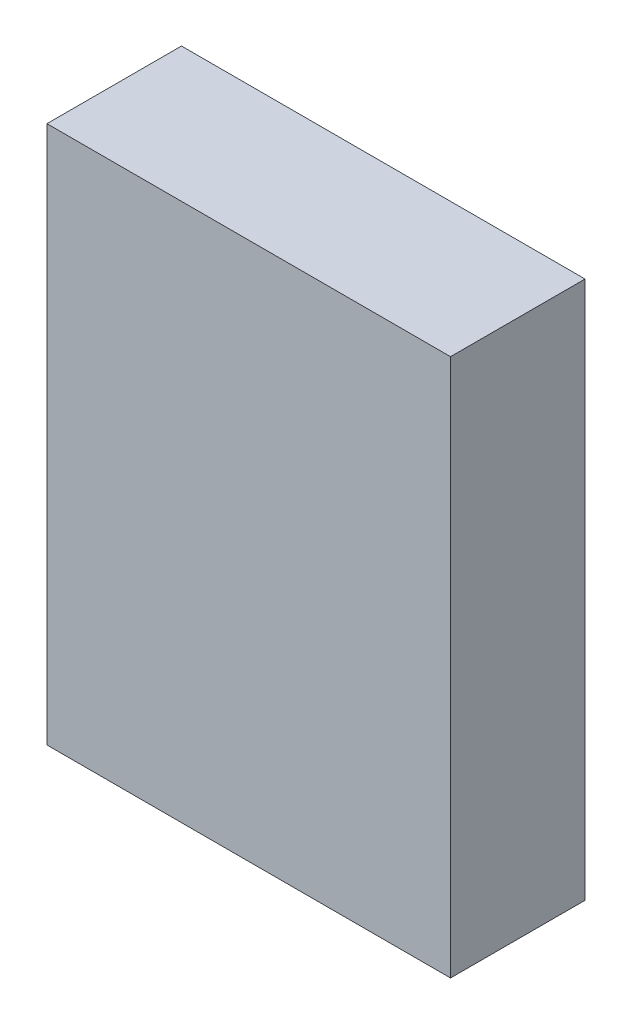
ISO-10303-21;
HEADER;
FILE_DESCRIPTION(('STEP AP214'),'2;1');
FILE_NAME('part.step','',(''),(''),'','','');
FILE_SCHEMA(('AUTOMOTIVE_DESIGN { 1 0 10303 214 1 1 1 1 }'));
ENDSEC;
DATA;
#1=APPLICATION_CONTEXT('core data for automotive mechanical design processes');
#2=APPLICATION_PROTOCOL_DEFINITION('international standard','automotive_design',2000,#1);
#3=PRODUCT_CONTEXT('',#1,'mechanical');
#4=PRODUCT('Part','Part','',(#3));
#5=PRODUCT_RELATED_PRODUCT_CATEGORY('part','',(#4));
#6=PRODUCT_DEFINITION_FORMATION('','',#4);
#7=PRODUCT_DEFINITION_CONTEXT('part definition',#1,'design');
#8=PRODUCT_DEFINITION('design','',#6,#7);
#9=PRODUCT_DEFINITION_SHAPE('','',#8);
#10=(LENGTH_UNIT() NAMED_UNIT(*) SI_UNIT(.MILLI.,.METRE.));
#11=(NAMED_UNIT(*) PLANE_ANGLE_UNIT() SI_UNIT($,.RADIAN.));
#12=(NAMED_UNIT(*) SI_UNIT($,.STERADIAN.) SOLID_ANGLE_UNIT());
#13=UNCERTAINTY_MEASURE_WITH_UNIT(LENGTH_MEASURE(1.E-05),#10,'distance_accuracy_value','');
#14=(GEOMETRIC_REPRESENTATION_CONTEXT(3) GLOBAL_UNCERTAINTY_ASSIGNED_CONTEXT((#13)) GLOBAL_UNIT_ASSIGNED_CONTEXT((#10,
#11,#12)) REPRESENTATION_CONTEXT('',''));
#15=CARTESIAN_POINT('',(0.,0.,0.));
#16=DIRECTION('',(0.,0.,1.));
#17=DIRECTION('',(1.,0.,0.));
#18=AXIS2_PLACEMENT_3D('',#15,#16,#17);
#19=CARTESIAN_POINT('',(0.,0.,2.));
#20=DIRECTION('',(1.,0.,0.));
#21=DIRECTION('',(0.,0.,-1.));
#22=AXIS2_PLACEMENT_3D('',#19,#20,#21);
#23=PLANE('',#22);
#24=DIRECTION('',(0.,-1.,0.));
#25=VECTOR('',#24,1.);
#26=CARTESIAN_POINT('',(0.,0.,0.));
#27=LINE('',#26,#25);
#28=CARTESIAN_POINT('',(0.,8.,0.));
#29=VERTEX_POINT('',#28);
#30=CARTESIAN_POINT('',(0.,0.,0.));
#31=VERTEX_POINT('',#30);
#32=EDGE_CURVE('E108',#29,#31,#27,.T.);
#33=ORIENTED_EDGE('',*,*,#32,.T.);
#34=DIRECTION('',(0.,0.,-1.));
#35=VECTOR('',#34,1.);
#36=CARTESIAN_POINT('',(0.,0.,2.));
#37=LINE('',#36,#35);
#38=CARTESIAN_POINT('',(0.,0.,2.));
#39=VERTEX_POINT('',#38);
#40=EDGE_CURVE('E11',#39,#31,#37,.T.);
#41=ORIENTED_EDGE('',*,*,#40,.F.);
#42=DIRECTION('',(0.,-1.,0.));
#43=VECTOR('',#42,1.);
#44=CARTESIAN_POINT('',(0.,0.,2.));
#45=LINE('',#44,#43);
#46=CARTESIAN_POINT('',(0.,8.,2.));
#47=VERTEX_POINT('',#46);
#48=EDGE_CURVE('E92',#47,#39,#45,.T.);
#49=ORIENTED_EDGE('',*,*,#48,.F.);
#50=DIRECTION('',(0.,0.,-1.));
#51=VECTOR('',#50,1.);
#52=CARTESIAN_POINT('',(0.,8.,2.));
#53=LINE('',#52,#51);
#54=EDGE_CURVE('E105',#47,#29,#53,.T.);
#55=ORIENTED_EDGE('',*,*,#54,.T.);
#56=EDGE_LOOP('',(#33,#41,#49,#55));
#57=FACE_BOUND('',#56,.T.);
#58=ADVANCED_FACE('F43',(#57),#23,.F.);
#59=CARTESIAN_POINT('',(0.,0.,2.));
#60=DIRECTION('',(0.,1.,0.));
#61=DIRECTION('',(0.,0.,1.));
#62=AXIS2_PLACEMENT_3D('',#59,#60,#61);
#63=PLANE('',#62);
#64=DIRECTION('',(1.,0.,0.));
#65=VECTOR('',#64,1.);
#66=CARTESIAN_POINT('',(0.,0.,0.));
#67=LINE('',#66,#65);
#68=CARTESIAN_POINT('',(6.,0.,0.));
#69=VERTEX_POINT('',#68);
#70=EDGE_CURVE('E97',#31,#69,#67,.T.);
#71=ORIENTED_EDGE('',*,*,#70,.T.);
#72=DIRECTION('',(0.,0.,-1.));
#73=VECTOR('',#72,1.);
#74=CARTESIAN_POINT('',(6.,0.,2.));
#75=LINE('',#74,#73);
#76=CARTESIAN_POINT('',(6.,0.,2.));
#77=VERTEX_POINT('',#76);
#78=EDGE_CURVE('E51',#77,#69,#75,.T.);
#79=ORIENTED_EDGE('',*,*,#78,.F.);
#80=DIRECTION('',(1.,0.,0.));
#81=VECTOR('',#80,1.);
#82=CARTESIAN_POINT('',(0.,0.,2.));
#83=LINE('',#82,#81);
#84=EDGE_CURVE('E87',#39,#77,#83,.T.);
#85=ORIENTED_EDGE('',*,*,#84,.F.);
#86=ORIENTED_EDGE('',*,*,#40,.T.);
#87=EDGE_LOOP('',(#71,#79,#85,#86));
#88=FACE_BOUND('',#87,.T.);
#89=ADVANCED_FACE('F100',(#88),#63,.F.);
#90=CARTESIAN_POINT('',(6.,0.,2.));
#91=DIRECTION('',(-1.,0.,0.));
#92=DIRECTION('',(0.,0.,1.));
#93=AXIS2_PLACEMENT_3D('',#90,#91,#92);
#94=PLANE('',#93);
#95=DIRECTION('',(0.,1.,0.));
#96=VECTOR('',#95,1.);
#97=CARTESIAN_POINT('',(6.,0.,0.));
#98=LINE('',#97,#96);
#99=CARTESIAN_POINT('',(6.,8.,0.));
#100=VERTEX_POINT('',#99);
#101=EDGE_CURVE('E78',#69,#100,#98,.T.);
#102=ORIENTED_EDGE('',*,*,#101,.T.);
#103=DIRECTION('',(0.,0.,-1.));
#104=VECTOR('',#103,1.);
#105=CARTESIAN_POINT('',(6.,8.,2.));
#106=LINE('',#105,#104);
#107=CARTESIAN_POINT('',(6.,8.,2.));
#108=VERTEX_POINT('',#107);
#109=EDGE_CURVE('E98',#108,#100,#106,.T.);
#110=ORIENTED_EDGE('',*,*,#109,.F.);
#111=DIRECTION('',(0.,1.,0.));
#112=VECTOR('',#111,1.);
#113=CARTESIAN_POINT('',(6.,0.,2.));
#114=LINE('',#113,#112);
#115=EDGE_CURVE('E95',#77,#108,#114,.T.);
#116=ORIENTED_EDGE('',*,*,#115,.F.);
#117=ORIENTED_EDGE('',*,*,#78,.T.);
#118=EDGE_LOOP('',(#102,#110,#116,#117));
#119=FACE_BOUND('',#118,.T.);
#120=ADVANCED_FACE('F99',(#119),#94,.F.);
#121=CARTESIAN_POINT('',(0.,8.,2.));
#122=DIRECTION('',(0.,-1.,0.));
#123=DIRECTION('',(0.,0.,-1.));
#124=AXIS2_PLACEMENT_3D('',#121,#122,#123);
#125=PLANE('',#124);
#126=DIRECTION('',(-1.,0.,0.));
#127=VECTOR('',#126,1.);
#128=CARTESIAN_POINT('',(0.,8.,0.));
#129=LINE('',#128,#127);
#130=EDGE_CURVE('E85',#100,#29,#129,.T.);
#131=ORIENTED_EDGE('',*,*,#130,.T.);
#132=ORIENTED_EDGE('',*,*,#54,.F.);
#133=DIRECTION('',(-1.,0.,0.));
#134=VECTOR('',#133,1.);
#135=CARTESIAN_POINT('',(0.,8.,2.));
#136=LINE('',#135,#134);
#137=EDGE_CURVE('E56',#108,#47,#136,.T.);
#138=ORIENTED_EDGE('',*,*,#137,.F.);
#139=ORIENTED_EDGE('',*,*,#109,.T.);
#140=EDGE_LOOP('',(#131,#132,#138,#139));
#141=FACE_BOUND('',#140,.T.);
#142=ADVANCED_FACE('F111',(#141),#125,.F.);
#143=CARTESIAN_POINT('',(0.,0.,2.));
#144=DIRECTION('',(0.,0.,-1.));
#145=DIRECTION('',(-1.,0.,0.));
#146=AXIS2_PLACEMENT_3D('',#143,#144,#145);
#147=PLANE('',#146);
#148=ORIENTED_EDGE('',*,*,#48,.T.);
#149=ORIENTED_EDGE('',*,*,#84,.T.);
#150=ORIENTED_EDGE('',*,*,#115,.T.);
#151=ORIENTED_EDGE('',*,*,#137,.T.);
#152=EDGE_LOOP('',(#148,#149,#150,#151));
#153=FACE_BOUND('',#152,.T.);
#154=ADVANCED_FACE('F89',(#153),#147,.F.);
#155=CARTESIAN_POINT('',(0.,0.,0.));
#156=DIRECTION('',(0.,0.,-1.));
#157=DIRECTION('',(-1.,0.,0.));
#158=AXIS2_PLACEMENT_3D('',#155,#156,#157);
#159=PLANE('',#158);
#160=ORIENTED_EDGE('',*,*,#32,.F.);
#161=ORIENTED_EDGE('',*,*,#130,.F.);
#162=ORIENTED_EDGE('',*,*,#101,.F.);
#163=ORIENTED_EDGE('',*,*,#70,.F.);
#164=EDGE_LOOP('',(#160,#161,#162,#163));
#165=FACE_BOUND('',#164,.T.);
#166=ADVANCED_FACE('F118',(#165),#159,.T.);
#167=CLOSED_SHELL('',(#58,#89,#120,#142,#154,#166));
#168=MANIFOLD_SOLID_BREP('B2',#167);
#169=ADVANCED_BREP_SHAPE_REPRESENTATION('',(#18,#168),#14);
#170=SHAPE_DEFINITION_REPRESENTATION(#9,#169);
ENDSEC;
END-ISO-10303-21;
